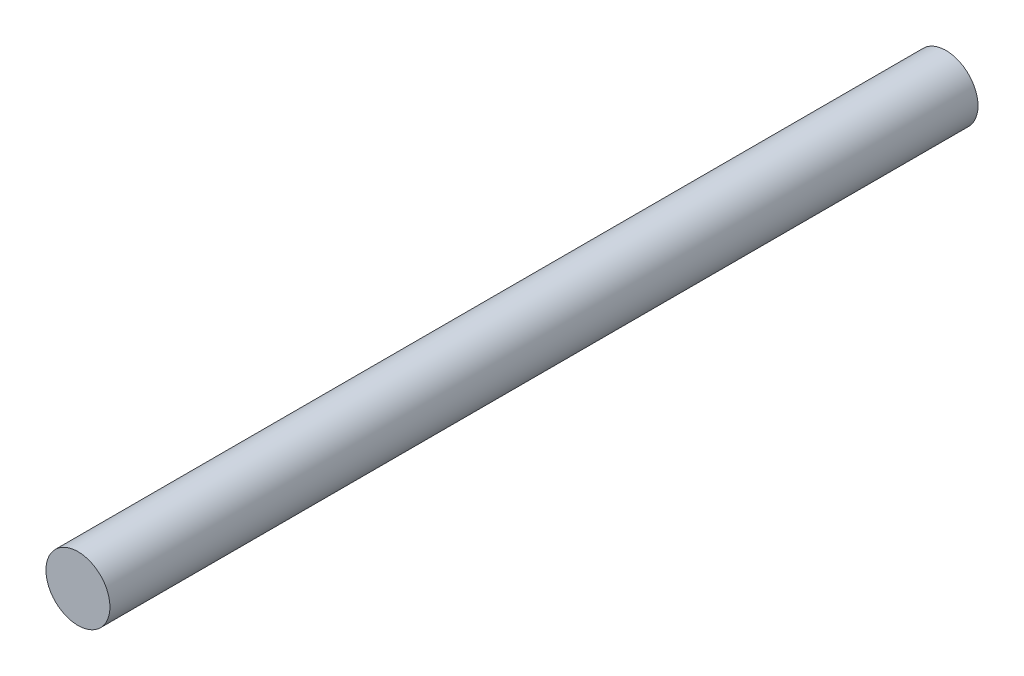
ISO-10303-21;
HEADER;
FILE_DESCRIPTION(('STEP AP214'),'2;1');
FILE_NAME('part.step','',(''),(''),'','','');
FILE_SCHEMA(('AUTOMOTIVE_DESIGN { 1 0 10303 214 1 1 1 1 }'));
ENDSEC;
DATA;
#1=APPLICATION_CONTEXT('core data for automotive mechanical design processes');
#2=APPLICATION_PROTOCOL_DEFINITION('international standard','automotive_design',2000,#1);
#3=PRODUCT_CONTEXT('',#1,'mechanical');
#4=PRODUCT('Part','Part','',(#3));
#5=PRODUCT_RELATED_PRODUCT_CATEGORY('part','',(#4));
#6=PRODUCT_DEFINITION_FORMATION('','',#4);
#7=PRODUCT_DEFINITION_CONTEXT('part definition',#1,'design');
#8=PRODUCT_DEFINITION('design','',#6,#7);
#9=PRODUCT_DEFINITION_SHAPE('','',#8);
#10=(LENGTH_UNIT() NAMED_UNIT(*) SI_UNIT(.MILLI.,.METRE.));
#11=(NAMED_UNIT(*) PLANE_ANGLE_UNIT() SI_UNIT($,.RADIAN.));
#12=(NAMED_UNIT(*) SI_UNIT($,.STERADIAN.) SOLID_ANGLE_UNIT());
#13=UNCERTAINTY_MEASURE_WITH_UNIT(LENGTH_MEASURE(1.E-05),#10,'distance_accuracy_value','');
#14=(GEOMETRIC_REPRESENTATION_CONTEXT(3) GLOBAL_UNCERTAINTY_ASSIGNED_CONTEXT((#13)) GLOBAL_UNIT_ASSIGNED_CONTEXT((#10,
#11,#12)) REPRESENTATION_CONTEXT('',''));
#15=CARTESIAN_POINT('',(0.,0.,0.));
#16=DIRECTION('',(0.,0.,1.));
#17=DIRECTION('',(1.,0.,0.));
#18=AXIS2_PLACEMENT_3D('',#15,#16,#17);
#19=CARTESIAN_POINT('',(0.,0.,108.5));
#20=DIRECTION('',(0.,0.,-1.));
#21=DIRECTION('',(-1.,0.,0.));
#22=AXIS2_PLACEMENT_3D('',#19,#20,#21);
#23=CYLINDRICAL_SURFACE('',#22,4.);
#24=CARTESIAN_POINT('',(0.,0.,108.5));
#25=DIRECTION('',(0.,0.,1.));
#26=DIRECTION('',(1.,0.,0.));
#27=AXIS2_PLACEMENT_3D('',#24,#25,#26);
#28=CIRCLE('',#27,4.);
#29=CARTESIAN_POINT('',(4.,0.,108.5));
#30=VERTEX_POINT('',#29);
#31=EDGE_CURVE('E10',#30,#30,#28,.T.);
#32=ORIENTED_EDGE('',*,*,#31,.F.);
#33=EDGE_LOOP('',(#32));
#34=FACE_BOUND('',#33,.T.);
#35=CARTESIAN_POINT('',(0.,0.,0.));
#36=DIRECTION('',(0.,0.,1.));
#37=DIRECTION('',(1.,0.,0.));
#38=AXIS2_PLACEMENT_3D('',#35,#36,#37);
#39=CIRCLE('',#38,4.);
#40=CARTESIAN_POINT('',(4.,0.,0.));
#41=VERTEX_POINT('',#40);
#42=EDGE_CURVE('E40',#41,#41,#39,.T.);
#43=ORIENTED_EDGE('',*,*,#42,.T.);
#44=EDGE_LOOP('',(#43));
#45=FACE_BOUND('',#44,.T.);
#46=ADVANCED_FACE('F37',(#34,#45),#23,.T.);
#47=CARTESIAN_POINT('',(0.,0.,108.5));
#48=DIRECTION('',(0.,0.,1.));
#49=DIRECTION('',(1.,0.,0.));
#50=AXIS2_PLACEMENT_3D('',#47,#48,#49);
#51=PLANE('',#50);
#52=ORIENTED_EDGE('',*,*,#31,.T.);
#53=EDGE_LOOP('',(#52));
#54=FACE_BOUND('',#53,.T.);
#55=ADVANCED_FACE('F54',(#54),#51,.T.);
#56=CARTESIAN_POINT('',(0.,0.,0.));
#57=DIRECTION('',(0.,0.,1.));
#58=DIRECTION('',(1.,0.,0.));
#59=AXIS2_PLACEMENT_3D('',#56,#57,#58);
#60=PLANE('',#59);
#61=ORIENTED_EDGE('',*,*,#42,.F.);
#62=EDGE_LOOP('',(#61));
#63=FACE_BOUND('',#62,.T.);
#64=ADVANCED_FACE('F52',(#63),#60,.F.);
#65=CLOSED_SHELL('',(#46,#55,#64));
#66=MANIFOLD_SOLID_BREP('B2',#65);
#67=ADVANCED_BREP_SHAPE_REPRESENTATION('',(#18,#66),#14);
#68=SHAPE_DEFINITION_REPRESENTATION(#9,#67);
ENDSEC;
END-ISO-10303-21;
